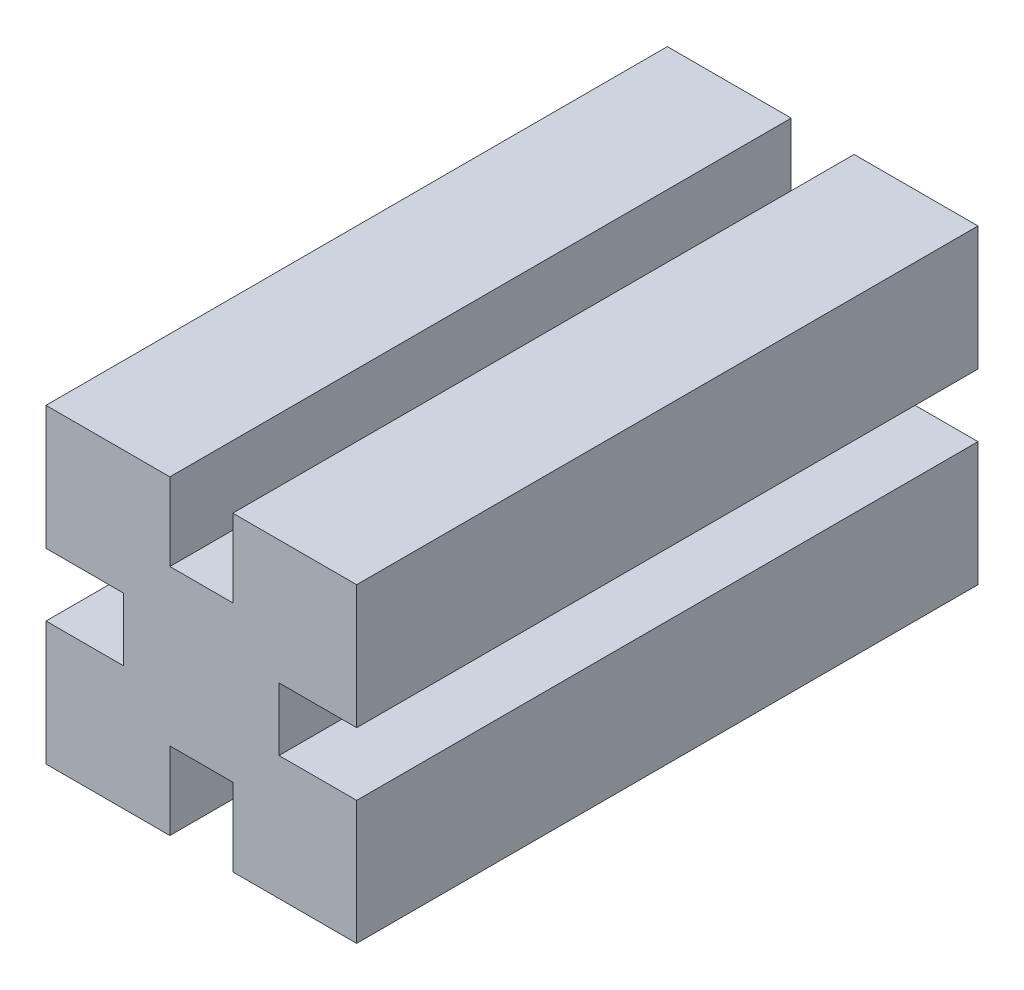
ISO-10303-21;
HEADER;
FILE_DESCRIPTION(('STEP AP214'),'2;1');
FILE_NAME('part.step','',(''),(''),'','','');
FILE_SCHEMA(('AUTOMOTIVE_DESIGN { 1 0 10303 214 1 1 1 1 }'));
ENDSEC;
DATA;
#1=APPLICATION_CONTEXT('core data for automotive mechanical design processes');
#2=APPLICATION_PROTOCOL_DEFINITION('international standard','automotive_design',2000,#1);
#3=PRODUCT_CONTEXT('',#1,'mechanical');
#4=PRODUCT('Part','Part','',(#3));
#5=PRODUCT_RELATED_PRODUCT_CATEGORY('part','',(#4));
#6=PRODUCT_DEFINITION_FORMATION('','',#4);
#7=PRODUCT_DEFINITION_CONTEXT('part definition',#1,'design');
#8=PRODUCT_DEFINITION('design','',#6,#7);
#9=PRODUCT_DEFINITION_SHAPE('','',#8);
#10=(LENGTH_UNIT() NAMED_UNIT(*) SI_UNIT(.MILLI.,.METRE.));
#11=(NAMED_UNIT(*) PLANE_ANGLE_UNIT() SI_UNIT($,.RADIAN.));
#12=(NAMED_UNIT(*) SI_UNIT($,.STERADIAN.) SOLID_ANGLE_UNIT());
#13=UNCERTAINTY_MEASURE_WITH_UNIT(LENGTH_MEASURE(1.E-05),#10,'distance_accuracy_value','');
#14=(GEOMETRIC_REPRESENTATION_CONTEXT(3) GLOBAL_UNCERTAINTY_ASSIGNED_CONTEXT((#13)) GLOBAL_UNIT_ASSIGNED_CONTEXT((#10,
#11,#12)) REPRESENTATION_CONTEXT('',''));
#15=CARTESIAN_POINT('',(0.,0.,0.));
#16=DIRECTION('',(0.,0.,1.));
#17=DIRECTION('',(1.,0.,0.));
#18=AXIS2_PLACEMENT_3D('',#15,#16,#17);
#19=CARTESIAN_POINT('',(0.,-10.,80.));
#20=DIRECTION('',(0.,1.,0.));
#21=DIRECTION('',(0.,0.,1.));
#22=AXIS2_PLACEMENT_3D('',#19,#20,#21);
#23=PLANE('',#22);
#24=DIRECTION('',(1.,0.,0.));
#25=VECTOR('',#24,1.);
#26=CARTESIAN_POINT('',(0.,-10.,0.));
#27=LINE('',#26,#25);
#28=CARTESIAN_POINT('',(-4.05,-10.,0.));
#29=VERTEX_POINT('',#28);
#30=CARTESIAN_POINT('',(4.05,-10.,0.));
#31=VERTEX_POINT('',#30);
#32=EDGE_CURVE('E272',#29,#31,#27,.T.);
#33=ORIENTED_EDGE('',*,*,#32,.T.);
#34=DIRECTION('',(0.,0.,-1.));
#35=VECTOR('',#34,1.);
#36=CARTESIAN_POINT('',(4.05,-10.,80.));
#37=LINE('',#36,#35);
#38=CARTESIAN_POINT('',(4.05,-10.,80.));
#39=VERTEX_POINT('',#38);
#40=EDGE_CURVE('E11',#39,#31,#37,.T.);
#41=ORIENTED_EDGE('',*,*,#40,.F.);
#42=DIRECTION('',(1.,0.,0.));
#43=VECTOR('',#42,1.);
#44=CARTESIAN_POINT('',(0.,-10.,80.));
#45=LINE('',#44,#43);
#46=CARTESIAN_POINT('',(-4.05,-10.,80.));
#47=VERTEX_POINT('',#46);
#48=EDGE_CURVE('E212',#47,#39,#45,.T.);
#49=ORIENTED_EDGE('',*,*,#48,.F.);
#50=DIRECTION('',(0.,0.,-1.));
#51=VECTOR('',#50,1.);
#52=CARTESIAN_POINT('',(-4.05,-10.,80.));
#53=LINE('',#52,#51);
#54=EDGE_CURVE('E51',#47,#29,#53,.T.);
#55=ORIENTED_EDGE('',*,*,#54,.T.);
#56=EDGE_LOOP('',(#33,#41,#49,#55));
#57=FACE_BOUND('',#56,.T.);
#58=ADVANCED_FACE('F35',(#57),#23,.F.);
#59=CARTESIAN_POINT('',(4.05,0.,80.));
#60=DIRECTION('',(1.,0.,0.));
#61=DIRECTION('',(0.,0.,-1.));
#62=AXIS2_PLACEMENT_3D('',#59,#60,#61);
#63=PLANE('',#62);
#64=DIRECTION('',(0.,-1.,0.));
#65=VECTOR('',#64,1.);
#66=CARTESIAN_POINT('',(4.05,0.,0.));
#67=LINE('',#66,#65);
#68=CARTESIAN_POINT('',(4.05,-20.,0.));
#69=VERTEX_POINT('',#68);
#70=EDGE_CURVE('E265',#31,#69,#67,.T.);
#71=ORIENTED_EDGE('',*,*,#70,.T.);
#72=DIRECTION('',(0.,0.,-1.));
#73=VECTOR('',#72,1.);
#74=CARTESIAN_POINT('',(4.05,-20.,80.));
#75=LINE('',#74,#73);
#76=CARTESIAN_POINT('',(4.05,-20.,80.));
#77=VERTEX_POINT('',#76);
#78=EDGE_CURVE('E43',#77,#69,#75,.T.);
#79=ORIENTED_EDGE('',*,*,#78,.F.);
#80=DIRECTION('',(0.,-1.,0.));
#81=VECTOR('',#80,1.);
#82=CARTESIAN_POINT('',(4.05,0.,80.));
#83=LINE('',#82,#81);
#84=EDGE_CURVE('E126',#39,#77,#83,.T.);
#85=ORIENTED_EDGE('',*,*,#84,.F.);
#86=ORIENTED_EDGE('',*,*,#40,.T.);
#87=EDGE_LOOP('',(#71,#79,#85,#86));
#88=FACE_BOUND('',#87,.T.);
#89=ADVANCED_FACE('F328',(#88),#63,.F.);
#90=CARTESIAN_POINT('',(0.,-20.,80.));
#91=DIRECTION('',(0.,1.,0.));
#92=DIRECTION('',(0.,0.,1.));
#93=AXIS2_PLACEMENT_3D('',#90,#91,#92);
#94=PLANE('',#93);
#95=DIRECTION('',(1.,0.,0.));
#96=VECTOR('',#95,1.);
#97=CARTESIAN_POINT('',(0.,-20.,0.));
#98=LINE('',#97,#96);
#99=CARTESIAN_POINT('',(20.,-20.,0.));
#100=VERTEX_POINT('',#99);
#101=EDGE_CURVE('E221',#69,#100,#98,.T.);
#102=ORIENTED_EDGE('',*,*,#101,.T.);
#103=DIRECTION('',(0.,0.,-1.));
#104=VECTOR('',#103,1.);
#105=CARTESIAN_POINT('',(20.,-20.,80.));
#106=LINE('',#105,#104);
#107=CARTESIAN_POINT('',(20.,-20.,80.));
#108=VERTEX_POINT('',#107);
#109=EDGE_CURVE('E257',#108,#100,#106,.T.);
#110=ORIENTED_EDGE('',*,*,#109,.F.);
#111=DIRECTION('',(1.,0.,0.));
#112=VECTOR('',#111,1.);
#113=CARTESIAN_POINT('',(0.,-20.,80.));
#114=LINE('',#113,#112);
#115=EDGE_CURVE('E201',#77,#108,#114,.T.);
#116=ORIENTED_EDGE('',*,*,#115,.F.);
#117=ORIENTED_EDGE('',*,*,#78,.T.);
#118=EDGE_LOOP('',(#102,#110,#116,#117));
#119=FACE_BOUND('',#118,.T.);
#120=ADVANCED_FACE('F262',(#119),#94,.F.);
#121=CARTESIAN_POINT('',(20.,0.,80.));
#122=DIRECTION('',(1.,0.,0.));
#123=DIRECTION('',(0.,0.,-1.));
#124=AXIS2_PLACEMENT_3D('',#121,#122,#123);
#125=PLANE('',#124);
#126=DIRECTION('',(0.,-1.,0.));
#127=VECTOR('',#126,1.);
#128=CARTESIAN_POINT('',(20.,0.,0.));
#129=LINE('',#128,#127);
#130=CARTESIAN_POINT('',(20.,-4.05,0.));
#131=VERTEX_POINT('',#130);
#132=EDGE_CURVE('E268',#131,#100,#129,.T.);
#133=ORIENTED_EDGE('',*,*,#132,.F.);
#134=DIRECTION('',(0.,0.,-1.));
#135=VECTOR('',#134,1.);
#136=CARTESIAN_POINT('',(20.,-4.05,80.));
#137=LINE('',#136,#135);
#138=CARTESIAN_POINT('',(20.,-4.05,80.));
#139=VERTEX_POINT('',#138);
#140=EDGE_CURVE('E255',#139,#131,#137,.T.);
#141=ORIENTED_EDGE('',*,*,#140,.F.);
#142=DIRECTION('',(0.,-1.,0.));
#143=VECTOR('',#142,1.);
#144=CARTESIAN_POINT('',(20.,0.,80.));
#145=LINE('',#144,#143);
#146=EDGE_CURVE('E205',#139,#108,#145,.T.);
#147=ORIENTED_EDGE('',*,*,#146,.T.);
#148=ORIENTED_EDGE('',*,*,#109,.T.);
#149=EDGE_LOOP('',(#133,#141,#147,#148));
#150=FACE_BOUND('',#149,.T.);
#151=ADVANCED_FACE('F335',(#150),#125,.T.);
#152=CARTESIAN_POINT('',(0.,-4.05,80.));
#153=DIRECTION('',(0.,1.,0.));
#154=DIRECTION('',(-1.,0.,0.));
#155=AXIS2_PLACEMENT_3D('',#152,#153,#154);
#156=PLANE('',#155);
#157=DIRECTION('',(1.,0.,0.));
#158=VECTOR('',#157,1.);
#159=CARTESIAN_POINT('',(0.,-4.05,0.));
#160=LINE('',#159,#158);
#161=CARTESIAN_POINT('',(10.,-4.05,0.));
#162=VERTEX_POINT('',#161);
#163=EDGE_CURVE('E269',#162,#131,#160,.T.);
#164=ORIENTED_EDGE('',*,*,#163,.F.);
#165=DIRECTION('',(0.,0.,-1.));
#166=VECTOR('',#165,1.);
#167=CARTESIAN_POINT('',(10.,-4.05,80.));
#168=LINE('',#167,#166);
#169=CARTESIAN_POINT('',(10.,-4.05,80.));
#170=VERTEX_POINT('',#169);
#171=EDGE_CURVE('E253',#170,#162,#168,.T.);
#172=ORIENTED_EDGE('',*,*,#171,.F.);
#173=DIRECTION('',(1.,0.,0.));
#174=VECTOR('',#173,1.);
#175=CARTESIAN_POINT('',(0.,-4.05,80.));
#176=LINE('',#175,#174);
#177=EDGE_CURVE('E210',#170,#139,#176,.T.);
#178=ORIENTED_EDGE('',*,*,#177,.T.);
#179=ORIENTED_EDGE('',*,*,#140,.T.);
#180=EDGE_LOOP('',(#164,#172,#178,#179));
#181=FACE_BOUND('',#180,.T.);
#182=ADVANCED_FACE('F337',(#181),#156,.T.);
#183=CARTESIAN_POINT('',(10.,0.,80.));
#184=DIRECTION('',(1.,0.,0.));
#185=DIRECTION('',(0.,0.,-1.));
#186=AXIS2_PLACEMENT_3D('',#183,#184,#185);
#187=PLANE('',#186);
#188=DIRECTION('',(0.,-1.,0.));
#189=VECTOR('',#188,1.);
#190=CARTESIAN_POINT('',(10.,0.,0.));
#191=LINE('',#190,#189);
#192=CARTESIAN_POINT('',(10.,4.05,0.));
#193=VERTEX_POINT('',#192);
#194=EDGE_CURVE('E277',#193,#162,#191,.T.);
#195=ORIENTED_EDGE('',*,*,#194,.F.);
#196=DIRECTION('',(0.,0.,-1.));
#197=VECTOR('',#196,1.);
#198=CARTESIAN_POINT('',(10.,4.05,80.));
#199=LINE('',#198,#197);
#200=CARTESIAN_POINT('',(10.,4.05,80.));
#201=VERTEX_POINT('',#200);
#202=EDGE_CURVE('E251',#201,#193,#199,.T.);
#203=ORIENTED_EDGE('',*,*,#202,.F.);
#204=DIRECTION('',(0.,-1.,0.));
#205=VECTOR('',#204,1.);
#206=CARTESIAN_POINT('',(10.,0.,80.));
#207=LINE('',#206,#205);
#208=EDGE_CURVE('E410',#201,#170,#207,.T.);
#209=ORIENTED_EDGE('',*,*,#208,.T.);
#210=ORIENTED_EDGE('',*,*,#171,.T.);
#211=EDGE_LOOP('',(#195,#203,#209,#210));
#212=FACE_BOUND('',#211,.T.);
#213=ADVANCED_FACE('F340',(#212),#187,.T.);
#214=CARTESIAN_POINT('',(0.,4.05,80.));
#215=DIRECTION('',(0.,1.,0.));
#216=DIRECTION('',(0.,0.,1.));
#217=AXIS2_PLACEMENT_3D('',#214,#215,#216);
#218=PLANE('',#217);
#219=DIRECTION('',(1.,0.,0.));
#220=VECTOR('',#219,1.);
#221=CARTESIAN_POINT('',(0.,4.05,0.));
#222=LINE('',#221,#220);
#223=CARTESIAN_POINT('',(20.,4.05,0.));
#224=VERTEX_POINT('',#223);
#225=EDGE_CURVE('E280',#193,#224,#222,.T.);
#226=ORIENTED_EDGE('',*,*,#225,.T.);
#227=DIRECTION('',(0.,0.,-1.));
#228=VECTOR('',#227,1.);
#229=CARTESIAN_POINT('',(20.,4.05,80.));
#230=LINE('',#229,#228);
#231=CARTESIAN_POINT('',(20.,4.05,80.));
#232=VERTEX_POINT('',#231);
#233=EDGE_CURVE('E249',#232,#224,#230,.T.);
#234=ORIENTED_EDGE('',*,*,#233,.F.);
#235=DIRECTION('',(1.,0.,0.));
#236=VECTOR('',#235,1.);
#237=CARTESIAN_POINT('',(0.,4.05,80.));
#238=LINE('',#237,#236);
#239=EDGE_CURVE('E408',#201,#232,#238,.T.);
#240=ORIENTED_EDGE('',*,*,#239,.F.);
#241=ORIENTED_EDGE('',*,*,#202,.T.);
#242=EDGE_LOOP('',(#226,#234,#240,#241));
#243=FACE_BOUND('',#242,.T.);
#244=ADVANCED_FACE('F344',(#243),#218,.F.);
#245=CARTESIAN_POINT('',(20.,20.,0.));
#246=VERTEX_POINT('',#245);
#247=EDGE_CURVE('E271',#246,#224,#129,.T.);
#248=ORIENTED_EDGE('',*,*,#247,.F.);
#249=DIRECTION('',(0.,0.,-1.));
#250=VECTOR('',#249,1.);
#251=CARTESIAN_POINT('',(20.,20.,80.));
#252=LINE('',#251,#250);
#253=CARTESIAN_POINT('',(20.,20.,80.));
#254=VERTEX_POINT('',#253);
#255=EDGE_CURVE('E247',#254,#246,#252,.T.);
#256=ORIENTED_EDGE('',*,*,#255,.F.);
#257=EDGE_CURVE('E211',#254,#232,#145,.T.);
#258=ORIENTED_EDGE('',*,*,#257,.T.);
#259=ORIENTED_EDGE('',*,*,#233,.T.);
#260=EDGE_LOOP('',(#248,#256,#258,#259));
#261=FACE_BOUND('',#260,.T.);
#262=ADVANCED_FACE('F348',(#261),#125,.T.);
#263=CARTESIAN_POINT('',(0.,20.,80.));
#264=DIRECTION('',(0.,1.,0.));
#265=DIRECTION('',(0.,0.,1.));
#266=AXIS2_PLACEMENT_3D('',#263,#264,#265);
#267=PLANE('',#266);
#268=DIRECTION('',(1.,0.,0.));
#269=VECTOR('',#268,1.);
#270=CARTESIAN_POINT('',(0.,20.,0.));
#271=LINE('',#270,#269);
#272=CARTESIAN_POINT('',(4.05,20.,0.));
#273=VERTEX_POINT('',#272);
#274=EDGE_CURVE('E283',#273,#246,#271,.T.);
#275=ORIENTED_EDGE('',*,*,#274,.F.);
#276=DIRECTION('',(0.,0.,-1.));
#277=VECTOR('',#276,1.);
#278=CARTESIAN_POINT('',(4.05,20.,80.));
#279=LINE('',#278,#277);
#280=CARTESIAN_POINT('',(4.05,20.,80.));
#281=VERTEX_POINT('',#280);
#282=EDGE_CURVE('E245',#281,#273,#279,.T.);
#283=ORIENTED_EDGE('',*,*,#282,.F.);
#284=DIRECTION('',(1.,0.,0.));
#285=VECTOR('',#284,1.);
#286=CARTESIAN_POINT('',(0.,20.,80.));
#287=LINE('',#286,#285);
#288=EDGE_CURVE('E398',#281,#254,#287,.T.);
#289=ORIENTED_EDGE('',*,*,#288,.T.);
#290=ORIENTED_EDGE('',*,*,#255,.T.);
#291=EDGE_LOOP('',(#275,#283,#289,#290));
#292=FACE_BOUND('',#291,.T.);
#293=ADVANCED_FACE('F352',(#292),#267,.T.);
#294=CARTESIAN_POINT('',(4.05,0.,80.));
#295=DIRECTION('',(1.,0.,0.));
#296=DIRECTION('',(0.,0.,-1.));
#297=AXIS2_PLACEMENT_3D('',#294,#295,#296);
#298=PLANE('',#297);
#299=DIRECTION('',(0.,-1.,0.));
#300=VECTOR('',#299,1.);
#301=CARTESIAN_POINT('',(4.05,0.,0.));
#302=LINE('',#301,#300);
#303=CARTESIAN_POINT('',(4.05,10.,0.));
#304=VERTEX_POINT('',#303);
#305=EDGE_CURVE('E286',#273,#304,#302,.T.);
#306=ORIENTED_EDGE('',*,*,#305,.T.);
#307=DIRECTION('',(0.,0.,-1.));
#308=VECTOR('',#307,1.);
#309=CARTESIAN_POINT('',(4.05,10.,80.));
#310=LINE('',#309,#308);
#311=CARTESIAN_POINT('',(4.05,10.,80.));
#312=VERTEX_POINT('',#311);
#313=EDGE_CURVE('E243',#312,#304,#310,.T.);
#314=ORIENTED_EDGE('',*,*,#313,.F.);
#315=DIRECTION('',(0.,-1.,0.));
#316=VECTOR('',#315,1.);
#317=CARTESIAN_POINT('',(4.05,0.,80.));
#318=LINE('',#317,#316);
#319=EDGE_CURVE('E405',#281,#312,#318,.T.);
#320=ORIENTED_EDGE('',*,*,#319,.F.);
#321=ORIENTED_EDGE('',*,*,#282,.T.);
#322=EDGE_LOOP('',(#306,#314,#320,#321));
#323=FACE_BOUND('',#322,.T.);
#324=ADVANCED_FACE('F354',(#323),#298,.F.);
#325=CARTESIAN_POINT('',(0.,10.,80.));
#326=DIRECTION('',(0.,1.,0.));
#327=DIRECTION('',(0.,0.,1.));
#328=AXIS2_PLACEMENT_3D('',#325,#326,#327);
#329=PLANE('',#328);
#330=DIRECTION('',(1.,0.,0.));
#331=VECTOR('',#330,1.);
#332=CARTESIAN_POINT('',(0.,10.,0.));
#333=LINE('',#332,#331);
#334=CARTESIAN_POINT('',(-4.05,10.,0.));
#335=VERTEX_POINT('',#334);
#336=EDGE_CURVE('E290',#335,#304,#333,.T.);
#337=ORIENTED_EDGE('',*,*,#336,.F.);
#338=DIRECTION('',(0.,0.,-1.));
#339=VECTOR('',#338,1.);
#340=CARTESIAN_POINT('',(-4.05,10.,80.));
#341=LINE('',#340,#339);
#342=CARTESIAN_POINT('',(-4.05,10.,80.));
#343=VERTEX_POINT('',#342);
#344=EDGE_CURVE('E241',#343,#335,#341,.T.);
#345=ORIENTED_EDGE('',*,*,#344,.F.);
#346=DIRECTION('',(1.,0.,0.));
#347=VECTOR('',#346,1.);
#348=CARTESIAN_POINT('',(0.,10.,80.));
#349=LINE('',#348,#347);
#350=EDGE_CURVE('E402',#343,#312,#349,.T.);
#351=ORIENTED_EDGE('',*,*,#350,.T.);
#352=ORIENTED_EDGE('',*,*,#313,.T.);
#353=EDGE_LOOP('',(#337,#345,#351,#352));
#354=FACE_BOUND('',#353,.T.);
#355=ADVANCED_FACE('F357',(#354),#329,.T.);
#356=CARTESIAN_POINT('',(-4.05,0.,80.));
#357=DIRECTION('',(1.,0.,0.));
#358=DIRECTION('',(0.,0.,-1.));
#359=AXIS2_PLACEMENT_3D('',#356,#357,#358);
#360=PLANE('',#359);
#361=DIRECTION('',(0.,-1.,0.));
#362=VECTOR('',#361,1.);
#363=CARTESIAN_POINT('',(-4.05,0.,0.));
#364=LINE('',#363,#362);
#365=CARTESIAN_POINT('',(-4.05,20.,0.));
#366=VERTEX_POINT('',#365);
#367=EDGE_CURVE('E293',#366,#335,#364,.T.);
#368=ORIENTED_EDGE('',*,*,#367,.F.);
#369=DIRECTION('',(0.,0.,-1.));
#370=VECTOR('',#369,1.);
#371=CARTESIAN_POINT('',(-4.05,20.,80.));
#372=LINE('',#371,#370);
#373=CARTESIAN_POINT('',(-4.05,20.,80.));
#374=VERTEX_POINT('',#373);
#375=EDGE_CURVE('E239',#374,#366,#372,.T.);
#376=ORIENTED_EDGE('',*,*,#375,.F.);
#377=DIRECTION('',(0.,-1.,0.));
#378=VECTOR('',#377,1.);
#379=CARTESIAN_POINT('',(-4.05,0.,80.));
#380=LINE('',#379,#378);
#381=EDGE_CURVE('E396',#374,#343,#380,.T.);
#382=ORIENTED_EDGE('',*,*,#381,.T.);
#383=ORIENTED_EDGE('',*,*,#344,.T.);
#384=EDGE_LOOP('',(#368,#376,#382,#383));
#385=FACE_BOUND('',#384,.T.);
#386=ADVANCED_FACE('F361',(#385),#360,.T.);
#387=CARTESIAN_POINT('',(-20.,20.,0.));
#388=VERTEX_POINT('',#387);
#389=EDGE_CURVE('E287',#388,#366,#271,.T.);
#390=ORIENTED_EDGE('',*,*,#389,.F.);
#391=DIRECTION('',(0.,0.,-1.));
#392=VECTOR('',#391,1.);
#393=CARTESIAN_POINT('',(-20.,20.,80.));
#394=LINE('',#393,#392);
#395=CARTESIAN_POINT('',(-20.,20.,80.));
#396=VERTEX_POINT('',#395);
#397=EDGE_CURVE('E237',#396,#388,#394,.T.);
#398=ORIENTED_EDGE('',*,*,#397,.F.);
#399=EDGE_CURVE('E395',#396,#374,#287,.T.);
#400=ORIENTED_EDGE('',*,*,#399,.T.);
#401=ORIENTED_EDGE('',*,*,#375,.T.);
#402=EDGE_LOOP('',(#390,#398,#400,#401));
#403=FACE_BOUND('',#402,.T.);
#404=ADVANCED_FACE('F365',(#403),#267,.T.);
#405=CARTESIAN_POINT('',(-20.,0.,80.));
#406=DIRECTION('',(1.,0.,0.));
#407=DIRECTION('',(0.,0.,-1.));
#408=AXIS2_PLACEMENT_3D('',#405,#406,#407);
#409=PLANE('',#408);
#410=DIRECTION('',(0.,-1.,0.));
#411=VECTOR('',#410,1.);
#412=CARTESIAN_POINT('',(-20.,0.,0.));
#413=LINE('',#412,#411);
#414=CARTESIAN_POINT('',(-20.,4.05,0.));
#415=VERTEX_POINT('',#414);
#416=EDGE_CURVE('E296',#388,#415,#413,.T.);
#417=ORIENTED_EDGE('',*,*,#416,.T.);
#418=DIRECTION('',(0.,0.,-1.));
#419=VECTOR('',#418,1.);
#420=CARTESIAN_POINT('',(-20.,4.05,80.));
#421=LINE('',#420,#419);
#422=CARTESIAN_POINT('',(-20.,4.05,80.));
#423=VERTEX_POINT('',#422);
#424=EDGE_CURVE('E234',#423,#415,#421,.T.);
#425=ORIENTED_EDGE('',*,*,#424,.F.);
#426=DIRECTION('',(0.,-1.,0.));
#427=VECTOR('',#426,1.);
#428=CARTESIAN_POINT('',(-20.,0.,80.));
#429=LINE('',#428,#427);
#430=EDGE_CURVE('E188',#396,#423,#429,.T.);
#431=ORIENTED_EDGE('',*,*,#430,.F.);
#432=ORIENTED_EDGE('',*,*,#397,.T.);
#433=EDGE_LOOP('',(#417,#425,#431,#432));
#434=FACE_BOUND('',#433,.T.);
#435=ADVANCED_FACE('F369',(#434),#409,.F.);
#436=CARTESIAN_POINT('',(0.,4.05,80.));
#437=DIRECTION('',(0.,1.,0.));
#438=DIRECTION('',(-1.,0.,0.));
#439=AXIS2_PLACEMENT_3D('',#436,#437,#438);
#440=PLANE('',#439);
#441=DIRECTION('',(1.,0.,0.));
#442=VECTOR('',#441,1.);
#443=CARTESIAN_POINT('',(0.,4.05,0.));
#444=LINE('',#443,#442);
#445=CARTESIAN_POINT('',(-10.,4.05,0.));
#446=VERTEX_POINT('',#445);
#447=EDGE_CURVE('E298',#415,#446,#444,.T.);
#448=ORIENTED_EDGE('',*,*,#447,.T.);
#449=DIRECTION('',(0.,0.,-1.));
#450=VECTOR('',#449,1.);
#451=CARTESIAN_POINT('',(-10.,4.05,80.));
#452=LINE('',#451,#450);
#453=CARTESIAN_POINT('',(-10.,4.05,80.));
#454=VERTEX_POINT('',#453);
#455=EDGE_CURVE('E231',#454,#446,#452,.T.);
#456=ORIENTED_EDGE('',*,*,#455,.F.);
#457=DIRECTION('',(1.,0.,0.));
#458=VECTOR('',#457,1.);
#459=CARTESIAN_POINT('',(0.,4.05,80.));
#460=LINE('',#459,#458);
#461=EDGE_CURVE('E313',#423,#454,#460,.T.);
#462=ORIENTED_EDGE('',*,*,#461,.F.);
#463=ORIENTED_EDGE('',*,*,#424,.T.);
#464=EDGE_LOOP('',(#448,#456,#462,#463));
#465=FACE_BOUND('',#464,.T.);
#466=ADVANCED_FACE('F371',(#465),#440,.F.);
#467=CARTESIAN_POINT('',(-10.,0.,80.));
#468=DIRECTION('',(1.,0.,0.));
#469=DIRECTION('',(0.,0.,-1.));
#470=AXIS2_PLACEMENT_3D('',#467,#468,#469);
#471=PLANE('',#470);
#472=DIRECTION('',(0.,-1.,0.));
#473=VECTOR('',#472,1.);
#474=CARTESIAN_POINT('',(-10.,0.,0.));
#475=LINE('',#474,#473);
#476=CARTESIAN_POINT('',(-10.,-4.05,0.));
#477=VERTEX_POINT('',#476);
#478=EDGE_CURVE('E299',#446,#477,#475,.T.);
#479=ORIENTED_EDGE('',*,*,#478,.T.);
#480=DIRECTION('',(0.,0.,-1.));
#481=VECTOR('',#480,1.);
#482=CARTESIAN_POINT('',(-10.,-4.05,80.));
#483=LINE('',#482,#481);
#484=CARTESIAN_POINT('',(-10.,-4.05,80.));
#485=VERTEX_POINT('',#484);
#486=EDGE_CURVE('E229',#485,#477,#483,.T.);
#487=ORIENTED_EDGE('',*,*,#486,.F.);
#488=DIRECTION('',(0.,-1.,0.));
#489=VECTOR('',#488,1.);
#490=CARTESIAN_POINT('',(-10.,0.,80.));
#491=LINE('',#490,#489);
#492=EDGE_CURVE('E311',#454,#485,#491,.T.);
#493=ORIENTED_EDGE('',*,*,#492,.F.);
#494=ORIENTED_EDGE('',*,*,#455,.T.);
#495=EDGE_LOOP('',(#479,#487,#493,#494));
#496=FACE_BOUND('',#495,.T.);
#497=ADVANCED_FACE('F310',(#496),#471,.F.);
#498=CARTESIAN_POINT('',(0.,-4.05,80.));
#499=DIRECTION('',(0.,1.,0.));
#500=DIRECTION('',(-1.,0.,0.));
#501=AXIS2_PLACEMENT_3D('',#498,#499,#500);
#502=PLANE('',#501);
#503=DIRECTION('',(1.,0.,0.));
#504=VECTOR('',#503,1.);
#505=CARTESIAN_POINT('',(0.,-4.05,0.));
#506=LINE('',#505,#504);
#507=CARTESIAN_POINT('',(-20.,-4.05,0.));
#508=VERTEX_POINT('',#507);
#509=EDGE_CURVE('E224',#508,#477,#506,.T.);
#510=ORIENTED_EDGE('',*,*,#509,.F.);
#511=DIRECTION('',(0.,0.,-1.));
#512=VECTOR('',#511,1.);
#513=CARTESIAN_POINT('',(-20.,-4.05,80.));
#514=LINE('',#513,#512);
#515=CARTESIAN_POINT('',(-20.,-4.05,80.));
#516=VERTEX_POINT('',#515);
#517=EDGE_CURVE('E196',#516,#508,#514,.T.);
#518=ORIENTED_EDGE('',*,*,#517,.F.);
#519=DIRECTION('',(1.,0.,0.));
#520=VECTOR('',#519,1.);
#521=CARTESIAN_POINT('',(0.,-4.05,80.));
#522=LINE('',#521,#520);
#523=EDGE_CURVE('E185',#516,#485,#522,.T.);
#524=ORIENTED_EDGE('',*,*,#523,.T.);
#525=ORIENTED_EDGE('',*,*,#486,.T.);
#526=EDGE_LOOP('',(#510,#518,#524,#525));
#527=FACE_BOUND('',#526,.T.);
#528=ADVANCED_FACE('F308',(#527),#502,.T.);
#529=CARTESIAN_POINT('',(-20.,-20.,0.));
#530=VERTEX_POINT('',#529);
#531=EDGE_CURVE('E193',#508,#530,#413,.T.);
#532=ORIENTED_EDGE('',*,*,#531,.T.);
#533=DIRECTION('',(0.,0.,-1.));
#534=VECTOR('',#533,1.);
#535=CARTESIAN_POINT('',(-20.,-20.,80.));
#536=LINE('',#535,#534);
#537=CARTESIAN_POINT('',(-20.,-20.,80.));
#538=VERTEX_POINT('',#537);
#539=EDGE_CURVE('E190',#538,#530,#536,.T.);
#540=ORIENTED_EDGE('',*,*,#539,.F.);
#541=EDGE_CURVE('E178',#516,#538,#429,.T.);
#542=ORIENTED_EDGE('',*,*,#541,.F.);
#543=ORIENTED_EDGE('',*,*,#517,.T.);
#544=EDGE_LOOP('',(#532,#540,#542,#543));
#545=FACE_BOUND('',#544,.T.);
#546=ADVANCED_FACE('F191',(#545),#409,.F.);
#547=CARTESIAN_POINT('',(-4.05,-20.,0.));
#548=VERTEX_POINT('',#547);
#549=EDGE_CURVE('E217',#530,#548,#98,.T.);
#550=ORIENTED_EDGE('',*,*,#549,.T.);
#551=DIRECTION('',(0.,0.,-1.));
#552=VECTOR('',#551,1.);
#553=CARTESIAN_POINT('',(-4.05,-20.,80.));
#554=LINE('',#553,#552);
#555=CARTESIAN_POINT('',(-4.05,-20.,80.));
#556=VERTEX_POINT('',#555);
#557=EDGE_CURVE('E114',#556,#548,#554,.T.);
#558=ORIENTED_EDGE('',*,*,#557,.F.);
#559=EDGE_CURVE('E183',#538,#556,#114,.T.);
#560=ORIENTED_EDGE('',*,*,#559,.F.);
#561=ORIENTED_EDGE('',*,*,#539,.T.);
#562=EDGE_LOOP('',(#550,#558,#560,#561));
#563=FACE_BOUND('',#562,.T.);
#564=ADVANCED_FACE('F198',(#563),#94,.F.);
#565=CARTESIAN_POINT('',(-4.05,0.,80.));
#566=DIRECTION('',(1.,0.,0.));
#567=DIRECTION('',(0.,1.,0.));
#568=AXIS2_PLACEMENT_3D('',#565,#566,#567);
#569=PLANE('',#568);
#570=DIRECTION('',(0.,-1.,0.));
#571=VECTOR('',#570,1.);
#572=CARTESIAN_POINT('',(-4.05,0.,0.));
#573=LINE('',#572,#571);
#574=EDGE_CURVE('E213',#29,#548,#573,.T.);
#575=ORIENTED_EDGE('',*,*,#574,.F.);
#576=ORIENTED_EDGE('',*,*,#54,.F.);
#577=DIRECTION('',(0.,-1.,0.));
#578=VECTOR('',#577,1.);
#579=CARTESIAN_POINT('',(-4.05,0.,80.));
#580=LINE('',#579,#578);
#581=EDGE_CURVE('E199',#47,#556,#580,.T.);
#582=ORIENTED_EDGE('',*,*,#581,.T.);
#583=ORIENTED_EDGE('',*,*,#557,.T.);
#584=EDGE_LOOP('',(#575,#576,#582,#583));
#585=FACE_BOUND('',#584,.T.);
#586=ADVANCED_FACE('F317',(#585),#569,.T.);
#587=CARTESIAN_POINT('',(0.,0.,80.));
#588=DIRECTION('',(0.,0.,1.));
#589=DIRECTION('',(1.,0.,0.));
#590=AXIS2_PLACEMENT_3D('',#587,#588,#589);
#591=PLANE('',#590);
#592=ORIENTED_EDGE('',*,*,#48,.T.);
#593=ORIENTED_EDGE('',*,*,#84,.T.);
#594=ORIENTED_EDGE('',*,*,#115,.T.);
#595=ORIENTED_EDGE('',*,*,#146,.F.);
#596=ORIENTED_EDGE('',*,*,#177,.F.);
#597=ORIENTED_EDGE('',*,*,#208,.F.);
#598=ORIENTED_EDGE('',*,*,#239,.T.);
#599=ORIENTED_EDGE('',*,*,#257,.F.);
#600=ORIENTED_EDGE('',*,*,#288,.F.);
#601=ORIENTED_EDGE('',*,*,#319,.T.);
#602=ORIENTED_EDGE('',*,*,#350,.F.);
#603=ORIENTED_EDGE('',*,*,#381,.F.);
#604=ORIENTED_EDGE('',*,*,#399,.F.);
#605=ORIENTED_EDGE('',*,*,#430,.T.);
#606=ORIENTED_EDGE('',*,*,#461,.T.);
#607=ORIENTED_EDGE('',*,*,#492,.T.);
#608=ORIENTED_EDGE('',*,*,#523,.F.);
#609=ORIENTED_EDGE('',*,*,#541,.T.);
#610=ORIENTED_EDGE('',*,*,#559,.T.);
#611=ORIENTED_EDGE('',*,*,#581,.F.);
#612=EDGE_LOOP('',(#592,#593,#594,#595,#596,#597,#598,#599,#600,#601,#602,#603,#604,#605,#606,
#607,#608,#609,#610,#611));
#613=FACE_BOUND('',#612,.T.);
#614=ADVANCED_FACE('F180',(#613),#591,.T.);
#615=CARTESIAN_POINT('',(0.,0.,0.));
#616=DIRECTION('',(0.,0.,1.));
#617=DIRECTION('',(1.,0.,0.));
#618=AXIS2_PLACEMENT_3D('',#615,#616,#617);
#619=PLANE('',#618);
#620=ORIENTED_EDGE('',*,*,#32,.F.);
#621=ORIENTED_EDGE('',*,*,#574,.T.);
#622=ORIENTED_EDGE('',*,*,#549,.F.);
#623=ORIENTED_EDGE('',*,*,#531,.F.);
#624=ORIENTED_EDGE('',*,*,#509,.T.);
#625=ORIENTED_EDGE('',*,*,#478,.F.);
#626=ORIENTED_EDGE('',*,*,#447,.F.);
#627=ORIENTED_EDGE('',*,*,#416,.F.);
#628=ORIENTED_EDGE('',*,*,#389,.T.);
#629=ORIENTED_EDGE('',*,*,#367,.T.);
#630=ORIENTED_EDGE('',*,*,#336,.T.);
#631=ORIENTED_EDGE('',*,*,#305,.F.);
#632=ORIENTED_EDGE('',*,*,#274,.T.);
#633=ORIENTED_EDGE('',*,*,#247,.T.);
#634=ORIENTED_EDGE('',*,*,#225,.F.);
#635=ORIENTED_EDGE('',*,*,#194,.T.);
#636=ORIENTED_EDGE('',*,*,#163,.T.);
#637=ORIENTED_EDGE('',*,*,#132,.T.);
#638=ORIENTED_EDGE('',*,*,#101,.F.);
#639=ORIENTED_EDGE('',*,*,#70,.F.);
#640=EDGE_LOOP('',(#620,#621,#622,#623,#624,#625,#626,#627,#628,#629,#630,#631,#632,#633,#634,
#635,#636,#637,#638,#639));
#641=FACE_BOUND('',#640,.T.);
#642=ADVANCED_FACE('F264',(#641),#619,.F.);
#643=CLOSED_SHELL('',(#58,#89,#120,#151,#182,#213,#244,#262,#293,#324,#355,#386,#404,#435,#466,
#497,#528,#546,#564,#586,#614,#642));
#644=MANIFOLD_SOLID_BREP('B2',#643);
#645=ADVANCED_BREP_SHAPE_REPRESENTATION('',(#18,#644),#14);
#646=SHAPE_DEFINITION_REPRESENTATION(#9,#645);
ENDSEC;
END-ISO-10303-21;
